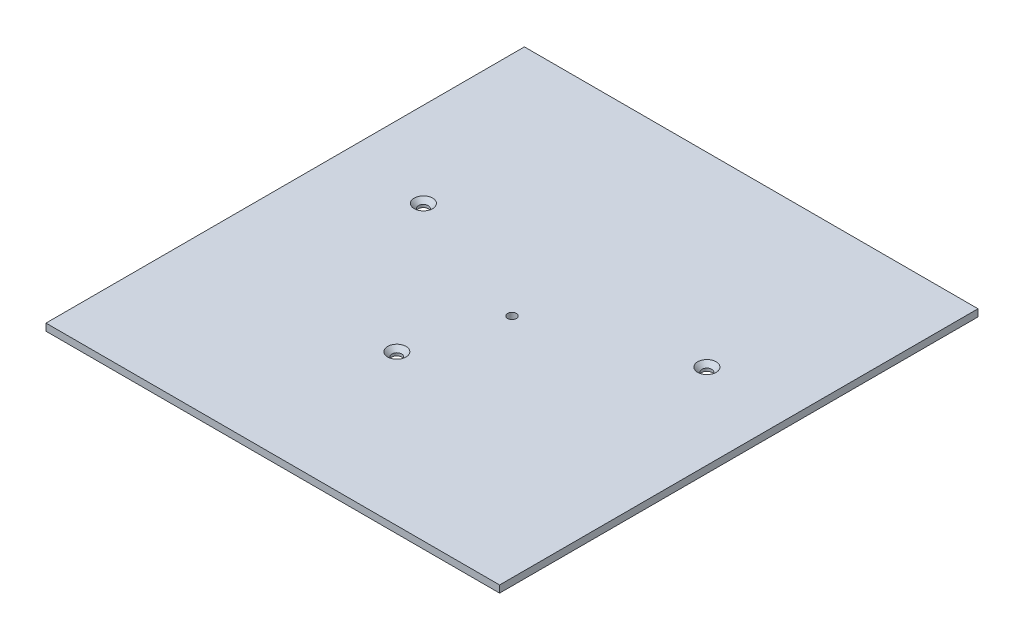
ISO-10303-21;
HEADER;
FILE_DESCRIPTION(('STEP AP214'),'2;1');
FILE_NAME('part.step','',(''),(''),'','','');
FILE_SCHEMA(('AUTOMOTIVE_DESIGN { 1 0 10303 214 1 1 1 1 }'));
ENDSEC;
DATA;
#1=APPLICATION_CONTEXT('core data for automotive mechanical design processes');
#2=APPLICATION_PROTOCOL_DEFINITION('international standard','automotive_design',2000,#1);
#3=PRODUCT_CONTEXT('',#1,'mechanical');
#4=PRODUCT('Part','Part','',(#3));
#5=PRODUCT_RELATED_PRODUCT_CATEGORY('part','',(#4));
#6=PRODUCT_DEFINITION_FORMATION('','',#4);
#7=PRODUCT_DEFINITION_CONTEXT('part definition',#1,'design');
#8=PRODUCT_DEFINITION('design','',#6,#7);
#9=PRODUCT_DEFINITION_SHAPE('','',#8);
#10=(LENGTH_UNIT() NAMED_UNIT(*) SI_UNIT(.MILLI.,.METRE.));
#11=(NAMED_UNIT(*) PLANE_ANGLE_UNIT() SI_UNIT($,.RADIAN.));
#12=(NAMED_UNIT(*) SI_UNIT($,.STERADIAN.) SOLID_ANGLE_UNIT());
#13=UNCERTAINTY_MEASURE_WITH_UNIT(LENGTH_MEASURE(1.E-05),#10,'distance_accuracy_value','');
#14=(GEOMETRIC_REPRESENTATION_CONTEXT(3) GLOBAL_UNCERTAINTY_ASSIGNED_CONTEXT((#13)) GLOBAL_UNIT_ASSIGNED_CONTEXT((#10,
#11,#12)) REPRESENTATION_CONTEXT('',''));
#15=CARTESIAN_POINT('',(0.,0.,0.));
#16=DIRECTION('',(0.,0.,1.));
#17=DIRECTION('',(1.,0.,0.));
#18=AXIS2_PLACEMENT_3D('',#15,#16,#17);
#19=CARTESIAN_POINT('',(0.,4.,0.));
#20=DIRECTION('',(0.,0.,-1.));
#21=DIRECTION('',(-1.,0.,0.));
#22=AXIS2_PLACEMENT_3D('',#19,#20,#21);
#23=PLANE('',#22);
#24=DIRECTION('',(1.,0.,0.));
#25=VECTOR('',#24,1.);
#26=CARTESIAN_POINT('',(0.,0.,0.));
#27=LINE('',#26,#25);
#28=CARTESIAN_POINT('',(0.,0.,0.));
#29=VERTEX_POINT('',#28);
#30=CARTESIAN_POINT('',(256.,0.,0.));
#31=VERTEX_POINT('',#30);
#32=EDGE_CURVE('E100',#29,#31,#27,.T.);
#33=ORIENTED_EDGE('',*,*,#32,.T.);
#34=DIRECTION('',(0.,-1.,0.));
#35=VECTOR('',#34,1.);
#36=CARTESIAN_POINT('',(256.,4.,0.));
#37=LINE('',#36,#35);
#38=CARTESIAN_POINT('',(256.,4.,0.));
#39=VERTEX_POINT('',#38);
#40=EDGE_CURVE('E11',#39,#31,#37,.T.);
#41=ORIENTED_EDGE('',*,*,#40,.F.);
#42=DIRECTION('',(1.,0.,0.));
#43=VECTOR('',#42,1.);
#44=CARTESIAN_POINT('',(0.,4.,0.));
#45=LINE('',#44,#43);
#46=CARTESIAN_POINT('',(0.,4.,0.));
#47=VERTEX_POINT('',#46);
#48=EDGE_CURVE('E88',#47,#39,#45,.T.);
#49=ORIENTED_EDGE('',*,*,#48,.F.);
#50=DIRECTION('',(0.,-1.,0.));
#51=VECTOR('',#50,1.);
#52=CARTESIAN_POINT('',(0.,4.,0.));
#53=LINE('',#52,#51);
#54=EDGE_CURVE('E96',#47,#29,#53,.T.);
#55=ORIENTED_EDGE('',*,*,#54,.T.);
#56=EDGE_LOOP('',(#33,#41,#49,#55));
#57=FACE_BOUND('',#56,.T.);
#58=ADVANCED_FACE('F37',(#57),#23,.F.);
#59=CARTESIAN_POINT('',(256.,4.,0.));
#60=DIRECTION('',(-1.,0.,0.));
#61=DIRECTION('',(0.,0.,1.));
#62=AXIS2_PLACEMENT_3D('',#59,#60,#61);
#63=PLANE('',#62);
#64=DIRECTION('',(0.,0.,-1.));
#65=VECTOR('',#64,1.);
#66=CARTESIAN_POINT('',(256.,0.,0.));
#67=LINE('',#66,#65);
#68=CARTESIAN_POINT('',(256.,0.,-270.));
#69=VERTEX_POINT('',#68);
#70=EDGE_CURVE('E92',#31,#69,#67,.T.);
#71=ORIENTED_EDGE('',*,*,#70,.T.);
#72=DIRECTION('',(0.,-1.,0.));
#73=VECTOR('',#72,1.);
#74=CARTESIAN_POINT('',(256.,4.,-270.));
#75=LINE('',#74,#73);
#76=CARTESIAN_POINT('',(256.,4.,-270.));
#77=VERTEX_POINT('',#76);
#78=EDGE_CURVE('E45',#77,#69,#75,.T.);
#79=ORIENTED_EDGE('',*,*,#78,.F.);
#80=DIRECTION('',(0.,0.,-1.));
#81=VECTOR('',#80,1.);
#82=CARTESIAN_POINT('',(256.,4.,0.));
#83=LINE('',#82,#81);
#84=EDGE_CURVE('E83',#39,#77,#83,.T.);
#85=ORIENTED_EDGE('',*,*,#84,.F.);
#86=ORIENTED_EDGE('',*,*,#40,.T.);
#87=EDGE_LOOP('',(#71,#79,#85,#86));
#88=FACE_BOUND('',#87,.T.);
#89=ADVANCED_FACE('F91',(#88),#63,.F.);
#90=CARTESIAN_POINT('',(0.,4.,-270.));
#91=DIRECTION('',(0.,0.,1.));
#92=DIRECTION('',(1.,0.,0.));
#93=AXIS2_PLACEMENT_3D('',#90,#91,#92);
#94=PLANE('',#93);
#95=DIRECTION('',(-1.,0.,0.));
#96=VECTOR('',#95,1.);
#97=CARTESIAN_POINT('',(0.,0.,-270.));
#98=LINE('',#97,#96);
#99=CARTESIAN_POINT('',(0.,0.,-270.));
#100=VERTEX_POINT('',#99);
#101=EDGE_CURVE('E70',#69,#100,#98,.T.);
#102=ORIENTED_EDGE('',*,*,#101,.T.);
#103=DIRECTION('',(0.,-1.,0.));
#104=VECTOR('',#103,1.);
#105=CARTESIAN_POINT('',(0.,4.,-270.));
#106=LINE('',#105,#104);
#107=CARTESIAN_POINT('',(0.,4.,-270.));
#108=VERTEX_POINT('',#107);
#109=EDGE_CURVE('E93',#108,#100,#106,.T.);
#110=ORIENTED_EDGE('',*,*,#109,.F.);
#111=DIRECTION('',(-1.,0.,0.));
#112=VECTOR('',#111,1.);
#113=CARTESIAN_POINT('',(0.,4.,-270.));
#114=LINE('',#113,#112);
#115=EDGE_CURVE('E86',#77,#108,#114,.T.);
#116=ORIENTED_EDGE('',*,*,#115,.F.);
#117=ORIENTED_EDGE('',*,*,#78,.T.);
#118=EDGE_LOOP('',(#102,#110,#116,#117));
#119=FACE_BOUND('',#118,.T.);
#120=ADVANCED_FACE('F94',(#119),#94,.F.);
#121=CARTESIAN_POINT('',(0.,4.,0.));
#122=DIRECTION('',(1.,0.,0.));
#123=DIRECTION('',(0.,0.,-1.));
#124=AXIS2_PLACEMENT_3D('',#121,#122,#123);
#125=PLANE('',#124);
#126=DIRECTION('',(0.,0.,1.));
#127=VECTOR('',#126,1.);
#128=CARTESIAN_POINT('',(0.,0.,0.));
#129=LINE('',#128,#127);
#130=EDGE_CURVE('E76',#100,#29,#129,.T.);
#131=ORIENTED_EDGE('',*,*,#130,.T.);
#132=ORIENTED_EDGE('',*,*,#54,.F.);
#133=DIRECTION('',(0.,0.,1.));
#134=VECTOR('',#133,1.);
#135=CARTESIAN_POINT('',(0.,4.,0.));
#136=LINE('',#135,#134);
#137=EDGE_CURVE('E53',#108,#47,#136,.T.);
#138=ORIENTED_EDGE('',*,*,#137,.F.);
#139=ORIENTED_EDGE('',*,*,#109,.T.);
#140=EDGE_LOOP('',(#131,#132,#138,#139));
#141=FACE_BOUND('',#140,.T.);
#142=ADVANCED_FACE('F108',(#141),#125,.F.);
#143=CARTESIAN_POINT('',(256.,4.,0.));
#144=DIRECTION('',(0.,1.,0.));
#145=DIRECTION('',(0.,0.,1.));
#146=AXIS2_PLACEMENT_3D('',#143,#144,#145);
#147=PLANE('',#146);
#148=CARTESIAN_POINT('',(128.,4.,-135.));
#149=DIRECTION('',(0.,1.,0.));
#150=DIRECTION('',(0.,0.,1.));
#151=AXIS2_PLACEMENT_3D('',#148,#149,#150);
#152=CIRCLE('',#151,2.5);
#153=CARTESIAN_POINT('',(128.,4.,-132.5));
#154=VERTEX_POINT('',#153);
#155=EDGE_CURVE('E143',#154,#154,#152,.T.);
#156=ORIENTED_EDGE('',*,*,#155,.F.);
#157=EDGE_LOOP('',(#156));
#158=FACE_BOUND('',#157,.T.);
#159=CARTESIAN_POINT('',(113.,4.,-85.));
#160=DIRECTION('',(0.,1.,0.));
#161=DIRECTION('',(0.,0.,1.));
#162=AXIS2_PLACEMENT_3D('',#159,#160,#161);
#163=CIRCLE('',#162,5.2);
#164=CARTESIAN_POINT('',(113.,4.,-79.8));
#165=VERTEX_POINT('',#164);
#166=EDGE_CURVE('E137',#165,#165,#163,.T.);
#167=ORIENTED_EDGE('',*,*,#166,.F.);
#168=EDGE_LOOP('',(#167));
#169=FACE_BOUND('',#168,.T.);
#170=CARTESIAN_POINT('',(208.,4.,-165.));
#171=DIRECTION('',(0.,1.,0.));
#172=DIRECTION('',(0.,0.,1.));
#173=AXIS2_PLACEMENT_3D('',#170,#171,#172);
#174=CIRCLE('',#173,5.20000000000001);
#175=CARTESIAN_POINT('',(208.,4.,-159.8));
#176=VERTEX_POINT('',#175);
#177=EDGE_CURVE('E128',#176,#176,#174,.T.);
#178=ORIENTED_EDGE('',*,*,#177,.F.);
#179=EDGE_LOOP('',(#178));
#180=FACE_BOUND('',#179,.T.);
#181=CARTESIAN_POINT('',(48.,4.,-165.));
#182=DIRECTION('',(0.,1.,0.));
#183=DIRECTION('',(0.,0.,1.));
#184=AXIS2_PLACEMENT_3D('',#181,#182,#183);
#185=CIRCLE('',#184,5.2);
#186=CARTESIAN_POINT('',(48.,4.,-159.8));
#187=VERTEX_POINT('',#186);
#188=EDGE_CURVE('E119',#187,#187,#185,.T.);
#189=ORIENTED_EDGE('',*,*,#188,.F.);
#190=EDGE_LOOP('',(#189));
#191=FACE_BOUND('',#190,.T.);
#192=ORIENTED_EDGE('',*,*,#48,.T.);
#193=ORIENTED_EDGE('',*,*,#84,.T.);
#194=ORIENTED_EDGE('',*,*,#115,.T.);
#195=ORIENTED_EDGE('',*,*,#137,.T.);
#196=EDGE_LOOP('',(#192,#193,#194,#195));
#197=FACE_BOUND('',#196,.T.);
#198=ADVANCED_FACE('F84',(#158,#169,#180,#191,#197),#147,.T.);
#199=CARTESIAN_POINT('',(256.,0.,0.));
#200=DIRECTION('',(0.,1.,0.));
#201=DIRECTION('',(0.,0.,1.));
#202=AXIS2_PLACEMENT_3D('',#199,#200,#201);
#203=PLANE('',#202);
#204=CARTESIAN_POINT('',(128.,0.,-135.));
#205=DIRECTION('',(0.,1.,0.));
#206=DIRECTION('',(0.,0.,1.));
#207=AXIS2_PLACEMENT_3D('',#204,#205,#206);
#208=CIRCLE('',#207,2.5);
#209=CARTESIAN_POINT('',(128.,0.,-132.5));
#210=VERTEX_POINT('',#209);
#211=EDGE_CURVE('E140',#210,#210,#208,.T.);
#212=ORIENTED_EDGE('',*,*,#211,.T.);
#213=EDGE_LOOP('',(#212));
#214=FACE_BOUND('',#213,.T.);
#215=CARTESIAN_POINT('',(113.,0.,-85.));
#216=DIRECTION('',(0.,1.,0.));
#217=DIRECTION('',(0.,0.,1.));
#218=AXIS2_PLACEMENT_3D('',#215,#216,#217);
#219=CIRCLE('',#218,2.75);
#220=CARTESIAN_POINT('',(113.,0.,-82.25));
#221=VERTEX_POINT('',#220);
#222=EDGE_CURVE('E131',#221,#221,#219,.T.);
#223=ORIENTED_EDGE('',*,*,#222,.T.);
#224=EDGE_LOOP('',(#223));
#225=FACE_BOUND('',#224,.T.);
#226=CARTESIAN_POINT('',(208.,0.,-165.));
#227=DIRECTION('',(0.,1.,0.));
#228=DIRECTION('',(0.,0.,1.));
#229=AXIS2_PLACEMENT_3D('',#226,#227,#228);
#230=CIRCLE('',#229,2.75);
#231=CARTESIAN_POINT('',(208.,0.,-162.25));
#232=VERTEX_POINT('',#231);
#233=EDGE_CURVE('E122',#232,#232,#230,.T.);
#234=ORIENTED_EDGE('',*,*,#233,.T.);
#235=EDGE_LOOP('',(#234));
#236=FACE_BOUND('',#235,.T.);
#237=CARTESIAN_POINT('',(48.,0.,-165.));
#238=DIRECTION('',(0.,1.,0.));
#239=DIRECTION('',(0.,0.,1.));
#240=AXIS2_PLACEMENT_3D('',#237,#238,#239);
#241=CIRCLE('',#240,2.75);
#242=CARTESIAN_POINT('',(48.,0.,-162.25));
#243=VERTEX_POINT('',#242);
#244=EDGE_CURVE('E103',#243,#243,#241,.T.);
#245=ORIENTED_EDGE('',*,*,#244,.T.);
#246=EDGE_LOOP('',(#245));
#247=FACE_BOUND('',#246,.T.);
#248=ORIENTED_EDGE('',*,*,#32,.F.);
#249=ORIENTED_EDGE('',*,*,#130,.F.);
#250=ORIENTED_EDGE('',*,*,#101,.F.);
#251=ORIENTED_EDGE('',*,*,#70,.F.);
#252=EDGE_LOOP('',(#248,#249,#250,#251));
#253=FACE_BOUND('',#252,.T.);
#254=ADVANCED_FACE('F111',(#214,#225,#236,#247,#253),#203,.F.);
#255=CARTESIAN_POINT('',(48.,4.,-165.));
#256=DIRECTION('',(0.,1.,0.));
#257=DIRECTION('',(0.,0.,1.));
#258=AXIS2_PLACEMENT_3D('',#255,#256,#257);
#259=CYLINDRICAL_SURFACE('',#258,2.75);
#260=ORIENTED_EDGE('',*,*,#244,.F.);
#261=EDGE_LOOP('',(#260));
#262=FACE_BOUND('',#261,.T.);
#263=CARTESIAN_POINT('',(48.,1.55,-165.));
#264=DIRECTION('',(0.,1.,0.));
#265=DIRECTION('',(0.,0.,1.));
#266=AXIS2_PLACEMENT_3D('',#263,#264,#265);
#267=CIRCLE('',#266,2.75);
#268=CARTESIAN_POINT('',(48.,1.55,-162.25));
#269=VERTEX_POINT('',#268);
#270=EDGE_CURVE('E116',#269,#269,#267,.T.);
#271=ORIENTED_EDGE('',*,*,#270,.T.);
#272=EDGE_LOOP('',(#271));
#273=FACE_BOUND('',#272,.T.);
#274=ADVANCED_FACE('F161',(#262,#273),#259,.F.);
#275=CARTESIAN_POINT('',(48.,4.,-165.));
#276=DIRECTION('',(0.,1.,0.));
#277=DIRECTION('',(0.,0.,1.));
#278=AXIS2_PLACEMENT_3D('',#275,#276,#277);
#279=CONICAL_SURFACE('',#278,5.2,0.785398163397448);
#280=ORIENTED_EDGE('',*,*,#270,.F.);
#281=EDGE_LOOP('',(#280));
#282=FACE_BOUND('',#281,.T.);
#283=ORIENTED_EDGE('',*,*,#188,.T.);
#284=EDGE_LOOP('',(#283));
#285=FACE_BOUND('',#284,.T.);
#286=ADVANCED_FACE('F158',(#282,#285),#279,.F.);
#287=CARTESIAN_POINT('',(208.,4.,-165.));
#288=DIRECTION('',(0.,1.,0.));
#289=DIRECTION('',(0.,0.,1.));
#290=AXIS2_PLACEMENT_3D('',#287,#288,#289);
#291=CYLINDRICAL_SURFACE('',#290,2.75);
#292=ORIENTED_EDGE('',*,*,#233,.F.);
#293=EDGE_LOOP('',(#292));
#294=FACE_BOUND('',#293,.T.);
#295=CARTESIAN_POINT('',(208.,1.55,-165.));
#296=DIRECTION('',(0.,1.,0.));
#297=DIRECTION('',(0.,0.,1.));
#298=AXIS2_PLACEMENT_3D('',#295,#296,#297);
#299=CIRCLE('',#298,2.75);
#300=CARTESIAN_POINT('',(208.,1.55,-162.25));
#301=VERTEX_POINT('',#300);
#302=EDGE_CURVE('E125',#301,#301,#299,.T.);
#303=ORIENTED_EDGE('',*,*,#302,.T.);
#304=EDGE_LOOP('',(#303));
#305=FACE_BOUND('',#304,.T.);
#306=ADVANCED_FACE('F160',(#294,#305),#291,.F.);
#307=CARTESIAN_POINT('',(208.,4.,-165.));
#308=DIRECTION('',(0.,1.,0.));
#309=DIRECTION('',(0.,0.,1.));
#310=AXIS2_PLACEMENT_3D('',#307,#308,#309);
#311=CONICAL_SURFACE('',#310,5.20000000000001,0.78539816339745);
#312=ORIENTED_EDGE('',*,*,#302,.F.);
#313=EDGE_LOOP('',(#312));
#314=FACE_BOUND('',#313,.T.);
#315=ORIENTED_EDGE('',*,*,#177,.T.);
#316=EDGE_LOOP('',(#315));
#317=FACE_BOUND('',#316,.T.);
#318=ADVANCED_FACE('F168',(#314,#317),#311,.F.);
#319=CARTESIAN_POINT('',(113.,4.,-85.));
#320=DIRECTION('',(0.,1.,0.));
#321=DIRECTION('',(0.,0.,1.));
#322=AXIS2_PLACEMENT_3D('',#319,#320,#321);
#323=CYLINDRICAL_SURFACE('',#322,2.75);
#324=ORIENTED_EDGE('',*,*,#222,.F.);
#325=EDGE_LOOP('',(#324));
#326=FACE_BOUND('',#325,.T.);
#327=CARTESIAN_POINT('',(113.,1.55,-85.));
#328=DIRECTION('',(0.,1.,0.));
#329=DIRECTION('',(0.,0.,1.));
#330=AXIS2_PLACEMENT_3D('',#327,#328,#329);
#331=CIRCLE('',#330,2.75);
#332=CARTESIAN_POINT('',(113.,1.55,-82.25));
#333=VERTEX_POINT('',#332);
#334=EDGE_CURVE('E134',#333,#333,#331,.T.);
#335=ORIENTED_EDGE('',*,*,#334,.T.);
#336=EDGE_LOOP('',(#335));
#337=FACE_BOUND('',#336,.T.);
#338=ADVANCED_FACE('F202',(#326,#337),#323,.F.);
#339=CARTESIAN_POINT('',(113.,4.,-85.));
#340=DIRECTION('',(0.,1.,0.));
#341=DIRECTION('',(0.,0.,1.));
#342=AXIS2_PLACEMENT_3D('',#339,#340,#341);
#343=CONICAL_SURFACE('',#342,5.2,0.785398163397447);
#344=ORIENTED_EDGE('',*,*,#334,.F.);
#345=EDGE_LOOP('',(#344));
#346=FACE_BOUND('',#345,.T.);
#347=ORIENTED_EDGE('',*,*,#166,.T.);
#348=EDGE_LOOP('',(#347));
#349=FACE_BOUND('',#348,.T.);
#350=ADVANCED_FACE('F207',(#346,#349),#343,.F.);
#351=CARTESIAN_POINT('',(128.,4.,-135.));
#352=DIRECTION('',(0.,1.,0.));
#353=DIRECTION('',(0.,0.,1.));
#354=AXIS2_PLACEMENT_3D('',#351,#352,#353);
#355=CYLINDRICAL_SURFACE('',#354,2.5);
#356=ORIENTED_EDGE('',*,*,#211,.F.);
#357=EDGE_LOOP('',(#356));
#358=FACE_BOUND('',#357,.T.);
#359=ORIENTED_EDGE('',*,*,#155,.T.);
#360=EDGE_LOOP('',(#359));
#361=FACE_BOUND('',#360,.T.);
#362=ADVANCED_FACE('F147',(#358,#361),#355,.F.);
#363=CLOSED_SHELL('',(#58,#89,#120,#142,#198,#254,#274,#286,#306,#318,#338,#350,#362));
#364=MANIFOLD_SOLID_BREP('B2',#363);
#365=ADVANCED_BREP_SHAPE_REPRESENTATION('',(#18,#364),#14);
#366=SHAPE_DEFINITION_REPRESENTATION(#9,#365);
ENDSEC;
END-ISO-10303-21;
